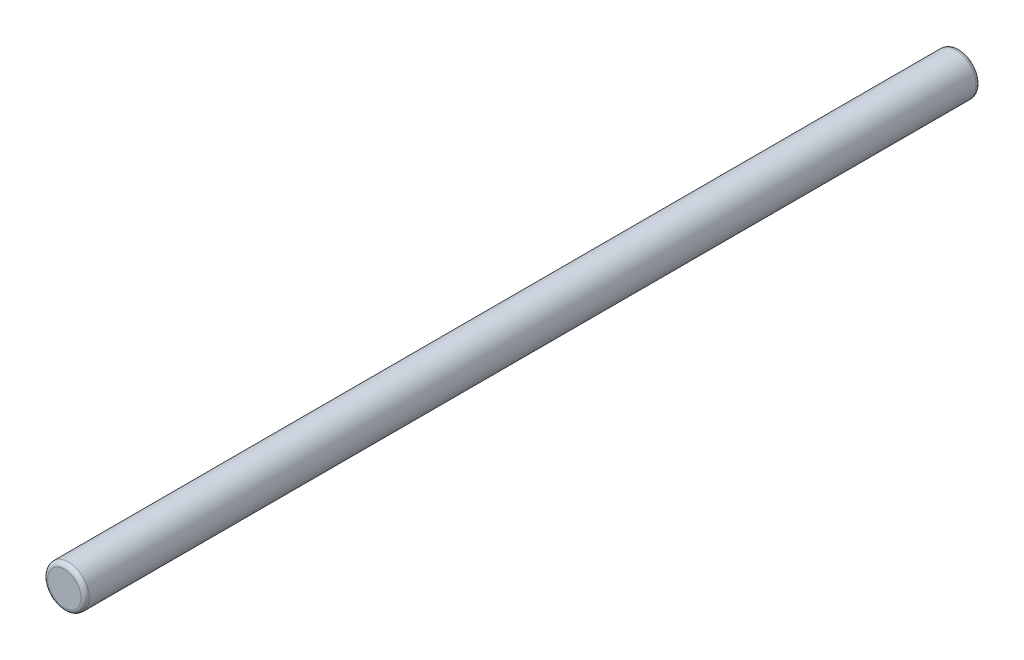
ISO-10303-21;
HEADER;
FILE_DESCRIPTION(('STEP AP214'),'2;1');
FILE_NAME('part.step','',(''),(''),'','','');
FILE_SCHEMA(('AUTOMOTIVE_DESIGN { 1 0 10303 214 1 1 1 1 }'));
ENDSEC;
DATA;
#1=APPLICATION_CONTEXT('core data for automotive mechanical design processes');
#2=APPLICATION_PROTOCOL_DEFINITION('international standard','automotive_design',2000,#1);
#3=PRODUCT_CONTEXT('',#1,'mechanical');
#4=PRODUCT('Part','Part','',(#3));
#5=PRODUCT_RELATED_PRODUCT_CATEGORY('part','',(#4));
#6=PRODUCT_DEFINITION_FORMATION('','',#4);
#7=PRODUCT_DEFINITION_CONTEXT('part definition',#1,'design');
#8=PRODUCT_DEFINITION('design','',#6,#7);
#9=PRODUCT_DEFINITION_SHAPE('','',#8);
#10=(LENGTH_UNIT() NAMED_UNIT(*) SI_UNIT(.MILLI.,.METRE.));
#11=(NAMED_UNIT(*) PLANE_ANGLE_UNIT() SI_UNIT($,.RADIAN.));
#12=(NAMED_UNIT(*) SI_UNIT($,.STERADIAN.) SOLID_ANGLE_UNIT());
#13=UNCERTAINTY_MEASURE_WITH_UNIT(LENGTH_MEASURE(1.E-05),#10,'distance_accuracy_value','');
#14=(GEOMETRIC_REPRESENTATION_CONTEXT(3) GLOBAL_UNCERTAINTY_ASSIGNED_CONTEXT((#13)) GLOBAL_UNIT_ASSIGNED_CONTEXT((#10,
#11,#12)) REPRESENTATION_CONTEXT('',''));
#15=CARTESIAN_POINT('',(0.,0.,0.));
#16=DIRECTION('',(0.,0.,1.));
#17=DIRECTION('',(1.,0.,0.));
#18=AXIS2_PLACEMENT_3D('',#15,#16,#17);
#19=CARTESIAN_POINT('',(0.,0.,43.));
#20=DIRECTION('',(0.,0.,-1.));
#21=DIRECTION('',(-1.,0.,0.));
#22=AXIS2_PLACEMENT_3D('',#19,#20,#21);
#23=CYLINDRICAL_SURFACE('',#22,1.);
#24=CARTESIAN_POINT('',(0.,0.,0.199999999999999));
#25=DIRECTION('',(0.,0.,1.));
#26=DIRECTION('',(1.,0.,0.));
#27=AXIS2_PLACEMENT_3D('',#24,#25,#26);
#28=CIRCLE('',#27,1.);
#29=CARTESIAN_POINT('',(1.,0.,0.199999999999999));
#30=VERTEX_POINT('',#29);
#31=EDGE_CURVE('E46',#30,#30,#28,.T.);
#32=ORIENTED_EDGE('',*,*,#31,.T.);
#33=EDGE_LOOP('',(#32));
#34=FACE_BOUND('',#33,.T.);
#35=CARTESIAN_POINT('',(0.,0.,42.8));
#36=DIRECTION('',(0.,0.,1.));
#37=DIRECTION('',(1.,0.,0.));
#38=AXIS2_PLACEMENT_3D('',#35,#36,#37);
#39=CIRCLE('',#38,1.);
#40=CARTESIAN_POINT('',(1.,0.,42.8));
#41=VERTEX_POINT('',#40);
#42=EDGE_CURVE('E50',#41,#41,#39,.F.);
#43=ORIENTED_EDGE('',*,*,#42,.T.);
#44=EDGE_LOOP('',(#43));
#45=FACE_BOUND('',#44,.T.);
#46=ADVANCED_FACE('F35',(#34,#45),#23,.T.);
#47=CARTESIAN_POINT('',(0.,0.,43.));
#48=DIRECTION('',(0.,0.,1.));
#49=DIRECTION('',(1.,0.,0.));
#50=AXIS2_PLACEMENT_3D('',#47,#48,#49);
#51=PLANE('',#50);
#52=CARTESIAN_POINT('',(0.,0.,43.));
#53=DIRECTION('',(0.,0.,1.));
#54=DIRECTION('',(1.,0.,0.));
#55=AXIS2_PLACEMENT_3D('',#52,#53,#54);
#56=CIRCLE('',#55,0.8);
#57=CARTESIAN_POINT('',(0.8,0.,43.));
#58=VERTEX_POINT('',#57);
#59=EDGE_CURVE('E10',#58,#58,#56,.T.);
#60=ORIENTED_EDGE('',*,*,#59,.T.);
#61=EDGE_LOOP('',(#60));
#62=FACE_BOUND('',#61,.T.);
#63=ADVANCED_FACE('F66',(#62),#51,.T.);
#64=CARTESIAN_POINT('',(0.,0.,0.));
#65=DIRECTION('',(0.,0.,1.));
#66=DIRECTION('',(1.,0.,0.));
#67=AXIS2_PLACEMENT_3D('',#64,#65,#66);
#68=PLANE('',#67);
#69=CARTESIAN_POINT('',(0.,0.,0.));
#70=DIRECTION('',(0.,0.,1.));
#71=DIRECTION('',(1.,0.,0.));
#72=AXIS2_PLACEMENT_3D('',#69,#70,#71);
#73=CIRCLE('',#72,0.8);
#74=CARTESIAN_POINT('',(0.8,0.,0.));
#75=VERTEX_POINT('',#74);
#76=EDGE_CURVE('E42',#75,#75,#73,.F.);
#77=ORIENTED_EDGE('',*,*,#76,.T.);
#78=EDGE_LOOP('',(#77));
#79=FACE_BOUND('',#78,.T.);
#80=ADVANCED_FACE('F63',(#79),#68,.F.);
#81=CARTESIAN_POINT('',(0.,0.,0.199999999999999));
#82=DIRECTION('',(0.,0.,1.));
#83=DIRECTION('',(1.,0.,0.));
#84=AXIS2_PLACEMENT_3D('',#81,#82,#83);
#85=TOROIDAL_SURFACE('',#84,0.8,0.2);
#86=ORIENTED_EDGE('',*,*,#76,.F.);
#87=EDGE_LOOP('',(#86));
#88=FACE_BOUND('',#87,.T.);
#89=ORIENTED_EDGE('',*,*,#31,.F.);
#90=EDGE_LOOP('',(#89));
#91=FACE_BOUND('',#90,.T.);
#92=ADVANCED_FACE('F59',(#88,#91),#85,.T.);
#93=CARTESIAN_POINT('',(0.,0.,42.8));
#94=DIRECTION('',(0.,0.,1.));
#95=DIRECTION('',(1.,0.,0.));
#96=AXIS2_PLACEMENT_3D('',#93,#94,#95);
#97=TOROIDAL_SURFACE('',#96,0.8,0.2);
#98=ORIENTED_EDGE('',*,*,#42,.F.);
#99=EDGE_LOOP('',(#98));
#100=FACE_BOUND('',#99,.T.);
#101=ORIENTED_EDGE('',*,*,#59,.F.);
#102=EDGE_LOOP('',(#101));
#103=FACE_BOUND('',#102,.T.);
#104=ADVANCED_FACE('F37',(#100,#103),#97,.T.);
#105=CLOSED_SHELL('',(#46,#63,#80,#92,#104));
#106=MANIFOLD_SOLID_BREP('B2',#105);
#107=ADVANCED_BREP_SHAPE_REPRESENTATION('',(#18,#106),#14);
#108=SHAPE_DEFINITION_REPRESENTATION(#9,#107);
ENDSEC;
END-ISO-10303-21;
